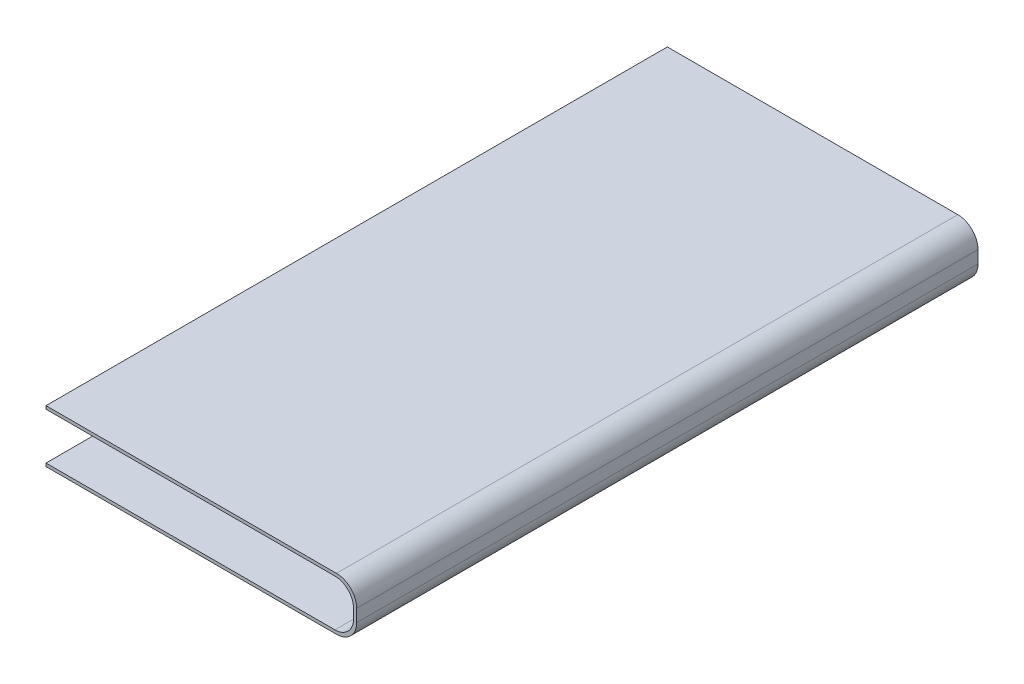
ISO-10303-21;
HEADER;
FILE_DESCRIPTION(('STEP AP214'),'2;1');
FILE_NAME('part.step','',(''),(''),'','','');
FILE_SCHEMA(('AUTOMOTIVE_DESIGN { 1 0 10303 214 1 1 1 1 }'));
ENDSEC;
DATA;
#1=APPLICATION_CONTEXT('core data for automotive mechanical design processes');
#2=APPLICATION_PROTOCOL_DEFINITION('international standard','automotive_design',2000,#1);
#3=PRODUCT_CONTEXT('',#1,'mechanical');
#4=PRODUCT('Part','Part','',(#3));
#5=PRODUCT_RELATED_PRODUCT_CATEGORY('part','',(#4));
#6=PRODUCT_DEFINITION_FORMATION('','',#4);
#7=PRODUCT_DEFINITION_CONTEXT('part definition',#1,'design');
#8=PRODUCT_DEFINITION('design','',#6,#7);
#9=PRODUCT_DEFINITION_SHAPE('','',#8);
#10=(LENGTH_UNIT() NAMED_UNIT(*) SI_UNIT(.MILLI.,.METRE.));
#11=(NAMED_UNIT(*) PLANE_ANGLE_UNIT() SI_UNIT($,.RADIAN.));
#12=(NAMED_UNIT(*) SI_UNIT($,.STERADIAN.) SOLID_ANGLE_UNIT());
#13=UNCERTAINTY_MEASURE_WITH_UNIT(LENGTH_MEASURE(1.E-05),#10,'distance_accuracy_value','');
#14=(GEOMETRIC_REPRESENTATION_CONTEXT(3) GLOBAL_UNCERTAINTY_ASSIGNED_CONTEXT((#13)) GLOBAL_UNIT_ASSIGNED_CONTEXT((#10,
#11,#12)) REPRESENTATION_CONTEXT('',''));
#15=CARTESIAN_POINT('',(0.,0.,0.));
#16=DIRECTION('',(0.,0.,1.));
#17=DIRECTION('',(1.,0.,0.));
#18=AXIS2_PLACEMENT_3D('',#15,#16,#17);
#19=CARTESIAN_POINT('',(14.4,-1.65,10.));
#20=DIRECTION('',(1.,0.,0.));
#21=DIRECTION('',(0.,0.,-1.));
#22=AXIS2_PLACEMENT_3D('',#19,#20,#21);
#23=PLANE('',#22);
#24=DIRECTION('',(0.,-1.,0.));
#25=VECTOR('',#24,1.);
#26=CARTESIAN_POINT('',(14.4,-1.65,-10.));
#27=LINE('',#26,#25);
#28=CARTESIAN_POINT('',(14.4,-1.65,-10.));
#29=VERTEX_POINT('',#28);
#30=CARTESIAN_POINT('',(14.4,-1.75,-10.));
#31=VERTEX_POINT('',#30);
#32=EDGE_CURVE('E153',#29,#31,#27,.T.);
#33=ORIENTED_EDGE('',*,*,#32,.T.);
#34=DIRECTION('',(0.,0.,-1.));
#35=VECTOR('',#34,1.);
#36=CARTESIAN_POINT('',(14.4,-1.75,10.));
#37=LINE('',#36,#35);
#38=CARTESIAN_POINT('',(14.4,-1.75,10.));
#39=VERTEX_POINT('',#38);
#40=EDGE_CURVE('E11',#39,#31,#37,.T.);
#41=ORIENTED_EDGE('',*,*,#40,.F.);
#42=DIRECTION('',(0.,-1.,0.));
#43=VECTOR('',#42,1.);
#44=CARTESIAN_POINT('',(14.4,-1.65,10.));
#45=LINE('',#44,#43);
#46=CARTESIAN_POINT('',(14.4,-1.65,10.));
#47=VERTEX_POINT('',#46);
#48=EDGE_CURVE('E175',#47,#39,#45,.T.);
#49=ORIENTED_EDGE('',*,*,#48,.F.);
#50=DIRECTION('',(0.,0.,-1.));
#51=VECTOR('',#50,1.);
#52=CARTESIAN_POINT('',(14.4,-1.65,10.));
#53=LINE('',#52,#51);
#54=EDGE_CURVE('E149',#47,#29,#53,.T.);
#55=ORIENTED_EDGE('',*,*,#54,.T.);
#56=EDGE_LOOP('',(#33,#41,#49,#55));
#57=FACE_BOUND('',#56,.T.);
#58=ADVANCED_FACE('F33',(#57),#23,.F.);
#59=CARTESIAN_POINT('',(14.4,-1.75,10.));
#60=DIRECTION('',(0.,1.,0.));
#61=DIRECTION('',(-1.,0.,0.));
#62=AXIS2_PLACEMENT_3D('',#59,#60,#61);
#63=PLANE('',#62);
#64=DIRECTION('',(1.,0.,0.));
#65=VECTOR('',#64,1.);
#66=CARTESIAN_POINT('',(14.4,-1.75,-10.));
#67=LINE('',#66,#65);
#68=CARTESIAN_POINT('',(23.7,-1.75,-10.));
#69=VERTEX_POINT('',#68);
#70=EDGE_CURVE('E156',#31,#69,#67,.T.);
#71=ORIENTED_EDGE('',*,*,#70,.T.);
#72=DIRECTION('',(0.,0.,-1.));
#73=VECTOR('',#72,1.);
#74=CARTESIAN_POINT('',(23.7,-1.75,10.));
#75=LINE('',#74,#73);
#76=CARTESIAN_POINT('',(23.7,-1.75,10.));
#77=VERTEX_POINT('',#76);
#78=EDGE_CURVE('E41',#77,#69,#75,.T.);
#79=ORIENTED_EDGE('',*,*,#78,.F.);
#80=DIRECTION('',(1.,0.,0.));
#81=VECTOR('',#80,1.);
#82=CARTESIAN_POINT('',(14.4,-1.75,10.));
#83=LINE('',#82,#81);
#84=EDGE_CURVE('E104',#39,#77,#83,.T.);
#85=ORIENTED_EDGE('',*,*,#84,.F.);
#86=ORIENTED_EDGE('',*,*,#40,.T.);
#87=EDGE_LOOP('',(#71,#79,#85,#86));
#88=FACE_BOUND('',#87,.T.);
#89=ADVANCED_FACE('F253',(#88),#63,.F.);
#90=CARTESIAN_POINT('',(23.7,-2.35,10.));
#91=DIRECTION('',(0.,0.,-1.));
#92=DIRECTION('',(-1.,0.,0.));
#93=AXIS2_PLACEMENT_3D('',#90,#91,#92);
#94=CYLINDRICAL_SURFACE('',#93,0.6);
#95=CARTESIAN_POINT('',(23.7,-2.35,-10.));
#96=DIRECTION('',(0.,0.,-1.));
#97=DIRECTION('',(-1.,0.,0.));
#98=AXIS2_PLACEMENT_3D('',#95,#96,#97);
#99=CIRCLE('',#98,0.6);
#100=CARTESIAN_POINT('',(24.3,-2.35,-10.));
#101=VERTEX_POINT('',#100);
#102=EDGE_CURVE('E158',#69,#101,#99,.T.);
#103=ORIENTED_EDGE('',*,*,#102,.T.);
#104=DIRECTION('',(0.,0.,-1.));
#105=VECTOR('',#104,1.);
#106=CARTESIAN_POINT('',(24.3,-2.35,10.));
#107=LINE('',#106,#105);
#108=CARTESIAN_POINT('',(24.3,-2.35,10.));
#109=VERTEX_POINT('',#108);
#110=EDGE_CURVE('E194',#109,#101,#107,.T.);
#111=ORIENTED_EDGE('',*,*,#110,.F.);
#112=CARTESIAN_POINT('',(23.7,-2.35,10.));
#113=DIRECTION('',(0.,0.,-1.));
#114=DIRECTION('',(-1.,0.,0.));
#115=AXIS2_PLACEMENT_3D('',#112,#113,#114);
#116=CIRCLE('',#115,0.6);
#117=EDGE_CURVE('E202',#77,#109,#116,.T.);
#118=ORIENTED_EDGE('',*,*,#117,.F.);
#119=ORIENTED_EDGE('',*,*,#78,.T.);
#120=EDGE_LOOP('',(#103,#111,#118,#119));
#121=FACE_BOUND('',#120,.T.);
#122=ADVANCED_FACE('F200',(#121),#94,.F.);
#123=CARTESIAN_POINT('',(24.3,-2.35,10.));
#124=DIRECTION('',(1.,0.,0.));
#125=DIRECTION('',(0.,0.,-1.));
#126=AXIS2_PLACEMENT_3D('',#123,#124,#125);
#127=PLANE('',#126);
#128=DIRECTION('',(0.,-1.,0.));
#129=VECTOR('',#128,1.);
#130=CARTESIAN_POINT('',(24.3,-2.35,-10.));
#131=LINE('',#130,#129);
#132=CARTESIAN_POINT('',(24.3,-2.65,-10.));
#133=VERTEX_POINT('',#132);
#134=EDGE_CURVE('E160',#101,#133,#131,.T.);
#135=ORIENTED_EDGE('',*,*,#134,.T.);
#136=DIRECTION('',(0.,0.,-1.));
#137=VECTOR('',#136,1.);
#138=CARTESIAN_POINT('',(24.3,-2.65,10.));
#139=LINE('',#138,#137);
#140=CARTESIAN_POINT('',(24.3,-2.65,10.));
#141=VERTEX_POINT('',#140);
#142=EDGE_CURVE('E191',#141,#133,#139,.T.);
#143=ORIENTED_EDGE('',*,*,#142,.F.);
#144=DIRECTION('',(0.,-1.,0.));
#145=VECTOR('',#144,1.);
#146=CARTESIAN_POINT('',(24.3,-2.35,10.));
#147=LINE('',#146,#145);
#148=EDGE_CURVE('E220',#109,#141,#147,.T.);
#149=ORIENTED_EDGE('',*,*,#148,.F.);
#150=ORIENTED_EDGE('',*,*,#110,.T.);
#151=EDGE_LOOP('',(#135,#143,#149,#150));
#152=FACE_BOUND('',#151,.T.);
#153=ADVANCED_FACE('F211',(#152),#127,.F.);
#154=CARTESIAN_POINT('',(23.7,-2.65,10.));
#155=DIRECTION('',(0.,0.,-1.));
#156=DIRECTION('',(-1.,0.,0.));
#157=AXIS2_PLACEMENT_3D('',#154,#155,#156);
#158=CYLINDRICAL_SURFACE('',#157,0.6);
#159=CARTESIAN_POINT('',(23.7,-2.65,-10.));
#160=DIRECTION('',(0.,0.,-1.));
#161=DIRECTION('',(-1.,0.,0.));
#162=AXIS2_PLACEMENT_3D('',#159,#160,#161);
#163=CIRCLE('',#162,0.6);
#164=CARTESIAN_POINT('',(23.7,-3.25,-10.));
#165=VERTEX_POINT('',#164);
#166=EDGE_CURVE('E162',#133,#165,#163,.T.);
#167=ORIENTED_EDGE('',*,*,#166,.T.);
#168=DIRECTION('',(0.,0.,-1.));
#169=VECTOR('',#168,1.);
#170=CARTESIAN_POINT('',(23.7,-3.25,10.));
#171=LINE('',#170,#169);
#172=CARTESIAN_POINT('',(23.7,-3.25,10.));
#173=VERTEX_POINT('',#172);
#174=EDGE_CURVE('E188',#173,#165,#171,.T.);
#175=ORIENTED_EDGE('',*,*,#174,.F.);
#176=CARTESIAN_POINT('',(23.7,-2.65,10.));
#177=DIRECTION('',(0.,0.,-1.));
#178=DIRECTION('',(-1.,0.,0.));
#179=AXIS2_PLACEMENT_3D('',#176,#177,#178);
#180=CIRCLE('',#179,0.6);
#181=EDGE_CURVE('E217',#141,#173,#180,.T.);
#182=ORIENTED_EDGE('',*,*,#181,.F.);
#183=ORIENTED_EDGE('',*,*,#142,.T.);
#184=EDGE_LOOP('',(#167,#175,#182,#183));
#185=FACE_BOUND('',#184,.T.);
#186=ADVANCED_FACE('F215',(#185),#158,.F.);
#187=CARTESIAN_POINT('',(23.7,-3.25,10.));
#188=DIRECTION('',(0.,-1.,0.));
#189=DIRECTION('',(1.,0.,0.));
#190=AXIS2_PLACEMENT_3D('',#187,#188,#189);
#191=PLANE('',#190);
#192=DIRECTION('',(-1.,0.,0.));
#193=VECTOR('',#192,1.);
#194=CARTESIAN_POINT('',(23.7,-3.25,-10.));
#195=LINE('',#194,#193);
#196=CARTESIAN_POINT('',(14.4,-3.25,-10.));
#197=VERTEX_POINT('',#196);
#198=EDGE_CURVE('E164',#165,#197,#195,.T.);
#199=ORIENTED_EDGE('',*,*,#198,.T.);
#200=DIRECTION('',(0.,0.,-1.));
#201=VECTOR('',#200,1.);
#202=CARTESIAN_POINT('',(14.4,-3.25,10.));
#203=LINE('',#202,#201);
#204=CARTESIAN_POINT('',(14.4,-3.25,10.));
#205=VERTEX_POINT('',#204);
#206=EDGE_CURVE('E185',#205,#197,#203,.T.);
#207=ORIENTED_EDGE('',*,*,#206,.F.);
#208=DIRECTION('',(-1.,0.,0.));
#209=VECTOR('',#208,1.);
#210=CARTESIAN_POINT('',(23.7,-3.25,10.));
#211=LINE('',#210,#209);
#212=EDGE_CURVE('E219',#173,#205,#211,.T.);
#213=ORIENTED_EDGE('',*,*,#212,.F.);
#214=ORIENTED_EDGE('',*,*,#174,.T.);
#215=EDGE_LOOP('',(#199,#207,#213,#214));
#216=FACE_BOUND('',#215,.T.);
#217=ADVANCED_FACE('F266',(#216),#191,.F.);
#218=CARTESIAN_POINT('',(14.4,-3.25,10.));
#219=DIRECTION('',(1.,0.,0.));
#220=DIRECTION('',(0.,0.,-1.));
#221=AXIS2_PLACEMENT_3D('',#218,#219,#220);
#222=PLANE('',#221);
#223=DIRECTION('',(0.,-1.,0.));
#224=VECTOR('',#223,1.);
#225=CARTESIAN_POINT('',(14.4,-3.25,-10.));
#226=LINE('',#225,#224);
#227=CARTESIAN_POINT('',(14.4,-3.35,-10.));
#228=VERTEX_POINT('',#227);
#229=EDGE_CURVE('E166',#197,#228,#226,.T.);
#230=ORIENTED_EDGE('',*,*,#229,.T.);
#231=DIRECTION('',(0.,0.,-1.));
#232=VECTOR('',#231,1.);
#233=CARTESIAN_POINT('',(14.4,-3.35,10.));
#234=LINE('',#233,#232);
#235=CARTESIAN_POINT('',(14.4,-3.35,10.));
#236=VERTEX_POINT('',#235);
#237=EDGE_CURVE('E182',#236,#228,#234,.T.);
#238=ORIENTED_EDGE('',*,*,#237,.F.);
#239=DIRECTION('',(0.,-1.,0.));
#240=VECTOR('',#239,1.);
#241=CARTESIAN_POINT('',(14.4,-3.25,10.));
#242=LINE('',#241,#240);
#243=EDGE_CURVE('E222',#205,#236,#242,.T.);
#244=ORIENTED_EDGE('',*,*,#243,.F.);
#245=ORIENTED_EDGE('',*,*,#206,.T.);
#246=EDGE_LOOP('',(#230,#238,#244,#245));
#247=FACE_BOUND('',#246,.T.);
#248=ADVANCED_FACE('F269',(#247),#222,.F.);
#249=CARTESIAN_POINT('',(23.75,-3.35,10.));
#250=DIRECTION('',(0.,1.,0.));
#251=DIRECTION('',(-1.,0.,0.));
#252=AXIS2_PLACEMENT_3D('',#249,#250,#251);
#253=PLANE('',#252);
#254=DIRECTION('',(1.,0.,0.));
#255=VECTOR('',#254,1.);
#256=CARTESIAN_POINT('',(23.75,-3.35,-10.));
#257=LINE('',#256,#255);
#258=CARTESIAN_POINT('',(23.75,-3.35,-10.));
#259=VERTEX_POINT('',#258);
#260=EDGE_CURVE('E168',#228,#259,#257,.T.);
#261=ORIENTED_EDGE('',*,*,#260,.T.);
#262=DIRECTION('',(0.,0.,-1.));
#263=VECTOR('',#262,1.);
#264=CARTESIAN_POINT('',(23.75,-3.35,10.));
#265=LINE('',#264,#263);
#266=CARTESIAN_POINT('',(23.75,-3.35,10.));
#267=VERTEX_POINT('',#266);
#268=EDGE_CURVE('E179',#267,#259,#265,.T.);
#269=ORIENTED_EDGE('',*,*,#268,.F.);
#270=DIRECTION('',(1.,0.,0.));
#271=VECTOR('',#270,1.);
#272=CARTESIAN_POINT('',(23.75,-3.35,10.));
#273=LINE('',#272,#271);
#274=EDGE_CURVE('E228',#236,#267,#273,.T.);
#275=ORIENTED_EDGE('',*,*,#274,.F.);
#276=ORIENTED_EDGE('',*,*,#237,.T.);
#277=EDGE_LOOP('',(#261,#269,#275,#276));
#278=FACE_BOUND('',#277,.T.);
#279=ADVANCED_FACE('F234',(#278),#253,.F.);
#280=CARTESIAN_POINT('',(23.75,-2.7,10.));
#281=DIRECTION('',(0.,0.,-1.));
#282=DIRECTION('',(-1.,0.,0.));
#283=AXIS2_PLACEMENT_3D('',#280,#281,#282);
#284=CYLINDRICAL_SURFACE('',#283,0.65);
#285=CARTESIAN_POINT('',(23.75,-2.7,-10.));
#286=DIRECTION('',(0.,0.,1.));
#287=DIRECTION('',(-1.,0.,0.));
#288=AXIS2_PLACEMENT_3D('',#285,#286,#287);
#289=CIRCLE('',#288,0.65);
#290=CARTESIAN_POINT('',(24.4,-2.7,-10.));
#291=VERTEX_POINT('',#290);
#292=EDGE_CURVE('E170',#259,#291,#289,.T.);
#293=ORIENTED_EDGE('',*,*,#292,.T.);
#294=DIRECTION('',(0.,0.,-1.));
#295=VECTOR('',#294,1.);
#296=CARTESIAN_POINT('',(24.4,-2.7,10.));
#297=LINE('',#296,#295);
#298=CARTESIAN_POINT('',(24.4,-2.7,10.));
#299=VERTEX_POINT('',#298);
#300=EDGE_CURVE('E144',#299,#291,#297,.T.);
#301=ORIENTED_EDGE('',*,*,#300,.F.);
#302=CARTESIAN_POINT('',(23.75,-2.7,10.));
#303=DIRECTION('',(0.,0.,1.));
#304=DIRECTION('',(-1.,0.,0.));
#305=AXIS2_PLACEMENT_3D('',#302,#303,#304);
#306=CIRCLE('',#305,0.65);
#307=EDGE_CURVE('E135',#267,#299,#306,.T.);
#308=ORIENTED_EDGE('',*,*,#307,.F.);
#309=ORIENTED_EDGE('',*,*,#268,.T.);
#310=EDGE_LOOP('',(#293,#301,#308,#309));
#311=FACE_BOUND('',#310,.T.);
#312=ADVANCED_FACE('F238',(#311),#284,.T.);
#313=CARTESIAN_POINT('',(24.4,-2.3,10.));
#314=DIRECTION('',(-1.,0.,0.));
#315=DIRECTION('',(0.,0.,1.));
#316=AXIS2_PLACEMENT_3D('',#313,#314,#315);
#317=PLANE('',#316);
#318=DIRECTION('',(0.,1.,0.));
#319=VECTOR('',#318,1.);
#320=CARTESIAN_POINT('',(24.4,-2.3,-10.));
#321=LINE('',#320,#319);
#322=CARTESIAN_POINT('',(24.4,-2.3,-10.));
#323=VERTEX_POINT('',#322);
#324=EDGE_CURVE('E143',#291,#323,#321,.T.);
#325=ORIENTED_EDGE('',*,*,#324,.T.);
#326=DIRECTION('',(0.,0.,-1.));
#327=VECTOR('',#326,1.);
#328=CARTESIAN_POINT('',(24.4,-2.3,10.));
#329=LINE('',#328,#327);
#330=CARTESIAN_POINT('',(24.4,-2.3,10.));
#331=VERTEX_POINT('',#330);
#332=EDGE_CURVE('E140',#331,#323,#329,.T.);
#333=ORIENTED_EDGE('',*,*,#332,.F.);
#334=DIRECTION('',(0.,1.,0.));
#335=VECTOR('',#334,1.);
#336=CARTESIAN_POINT('',(24.4,-2.3,10.));
#337=LINE('',#336,#335);
#338=EDGE_CURVE('E129',#299,#331,#337,.T.);
#339=ORIENTED_EDGE('',*,*,#338,.F.);
#340=ORIENTED_EDGE('',*,*,#300,.T.);
#341=EDGE_LOOP('',(#325,#333,#339,#340));
#342=FACE_BOUND('',#341,.T.);
#343=ADVANCED_FACE('F141',(#342),#317,.F.);
#344=CARTESIAN_POINT('',(23.75,-2.3,10.));
#345=DIRECTION('',(0.,0.,-1.));
#346=DIRECTION('',(-1.,0.,0.));
#347=AXIS2_PLACEMENT_3D('',#344,#345,#346);
#348=CYLINDRICAL_SURFACE('',#347,0.650000000000001);
#349=CARTESIAN_POINT('',(23.75,-2.3,-10.));
#350=DIRECTION('',(0.,0.,1.));
#351=DIRECTION('',(-1.,0.,0.));
#352=AXIS2_PLACEMENT_3D('',#349,#350,#351);
#353=CIRCLE('',#352,0.650000000000001);
#354=CARTESIAN_POINT('',(23.75,-1.65,-10.));
#355=VERTEX_POINT('',#354);
#356=EDGE_CURVE('E90',#323,#355,#353,.T.);
#357=ORIENTED_EDGE('',*,*,#356,.T.);
#358=DIRECTION('',(0.,0.,-1.));
#359=VECTOR('',#358,1.);
#360=CARTESIAN_POINT('',(23.75,-1.65,10.));
#361=LINE('',#360,#359);
#362=CARTESIAN_POINT('',(23.75,-1.65,10.));
#363=VERTEX_POINT('',#362);
#364=EDGE_CURVE('E145',#363,#355,#361,.T.);
#365=ORIENTED_EDGE('',*,*,#364,.F.);
#366=CARTESIAN_POINT('',(23.75,-2.3,10.));
#367=DIRECTION('',(0.,0.,1.));
#368=DIRECTION('',(-1.,0.,0.));
#369=AXIS2_PLACEMENT_3D('',#366,#367,#368);
#370=CIRCLE('',#369,0.650000000000001);
#371=EDGE_CURVE('E133',#331,#363,#370,.T.);
#372=ORIENTED_EDGE('',*,*,#371,.F.);
#373=ORIENTED_EDGE('',*,*,#332,.T.);
#374=EDGE_LOOP('',(#357,#365,#372,#373));
#375=FACE_BOUND('',#374,.T.);
#376=ADVANCED_FACE('F147',(#375),#348,.T.);
#377=CARTESIAN_POINT('',(14.4,-1.65,10.));
#378=DIRECTION('',(0.,-1.,0.));
#379=DIRECTION('',(1.,0.,0.));
#380=AXIS2_PLACEMENT_3D('',#377,#378,#379);
#381=PLANE('',#380);
#382=DIRECTION('',(-1.,0.,0.));
#383=VECTOR('',#382,1.);
#384=CARTESIAN_POINT('',(14.4,-1.65,-10.));
#385=LINE('',#384,#383);
#386=EDGE_CURVE('E96',#355,#29,#385,.T.);
#387=ORIENTED_EDGE('',*,*,#386,.T.);
#388=ORIENTED_EDGE('',*,*,#54,.F.);
#389=DIRECTION('',(-1.,0.,0.));
#390=VECTOR('',#389,1.);
#391=CARTESIAN_POINT('',(14.4,-1.65,10.));
#392=LINE('',#391,#390);
#393=EDGE_CURVE('E49',#363,#47,#392,.T.);
#394=ORIENTED_EDGE('',*,*,#393,.F.);
#395=ORIENTED_EDGE('',*,*,#364,.T.);
#396=EDGE_LOOP('',(#387,#388,#394,#395));
#397=FACE_BOUND('',#396,.T.);
#398=ADVANCED_FACE('F242',(#397),#381,.F.);
#399=CARTESIAN_POINT('',(23.7,-2.35,10.));
#400=DIRECTION('',(0.,0.,-1.));
#401=DIRECTION('',(-1.,0.,0.));
#402=AXIS2_PLACEMENT_3D('',#399,#400,#401);
#403=PLANE('',#402);
#404=ORIENTED_EDGE('',*,*,#48,.T.);
#405=ORIENTED_EDGE('',*,*,#84,.T.);
#406=ORIENTED_EDGE('',*,*,#117,.T.);
#407=ORIENTED_EDGE('',*,*,#148,.T.);
#408=ORIENTED_EDGE('',*,*,#181,.T.);
#409=ORIENTED_EDGE('',*,*,#212,.T.);
#410=ORIENTED_EDGE('',*,*,#243,.T.);
#411=ORIENTED_EDGE('',*,*,#274,.T.);
#412=ORIENTED_EDGE('',*,*,#307,.T.);
#413=ORIENTED_EDGE('',*,*,#338,.T.);
#414=ORIENTED_EDGE('',*,*,#371,.T.);
#415=ORIENTED_EDGE('',*,*,#393,.T.);
#416=EDGE_LOOP('',(#404,#405,#406,#407,#408,#409,#410,#411,#412,#413,#414,#415));
#417=FACE_BOUND('',#416,.T.);
#418=ADVANCED_FACE('F131',(#417),#403,.F.);
#419=CARTESIAN_POINT('',(23.7,-2.35,-10.));
#420=DIRECTION('',(0.,0.,-1.));
#421=DIRECTION('',(-1.,0.,0.));
#422=AXIS2_PLACEMENT_3D('',#419,#420,#421);
#423=PLANE('',#422);
#424=ORIENTED_EDGE('',*,*,#32,.F.);
#425=ORIENTED_EDGE('',*,*,#386,.F.);
#426=ORIENTED_EDGE('',*,*,#356,.F.);
#427=ORIENTED_EDGE('',*,*,#324,.F.);
#428=ORIENTED_EDGE('',*,*,#292,.F.);
#429=ORIENTED_EDGE('',*,*,#260,.F.);
#430=ORIENTED_EDGE('',*,*,#229,.F.);
#431=ORIENTED_EDGE('',*,*,#198,.F.);
#432=ORIENTED_EDGE('',*,*,#166,.F.);
#433=ORIENTED_EDGE('',*,*,#134,.F.);
#434=ORIENTED_EDGE('',*,*,#102,.F.);
#435=ORIENTED_EDGE('',*,*,#70,.F.);
#436=EDGE_LOOP('',(#424,#425,#426,#427,#428,#429,#430,#431,#432,#433,#434,#435));
#437=FACE_BOUND('',#436,.T.);
#438=ADVANCED_FACE('F206',(#437),#423,.T.);
#439=CLOSED_SHELL('',(#58,#89,#122,#153,#186,#217,#248,#279,#312,#343,#376,#398,#418,#438));
#440=MANIFOLD_SOLID_BREP('B2',#439);
#441=ADVANCED_BREP_SHAPE_REPRESENTATION('',(#18,#440),#14);
#442=SHAPE_DEFINITION_REPRESENTATION(#9,#441);
ENDSEC;
END-ISO-10303-21;
